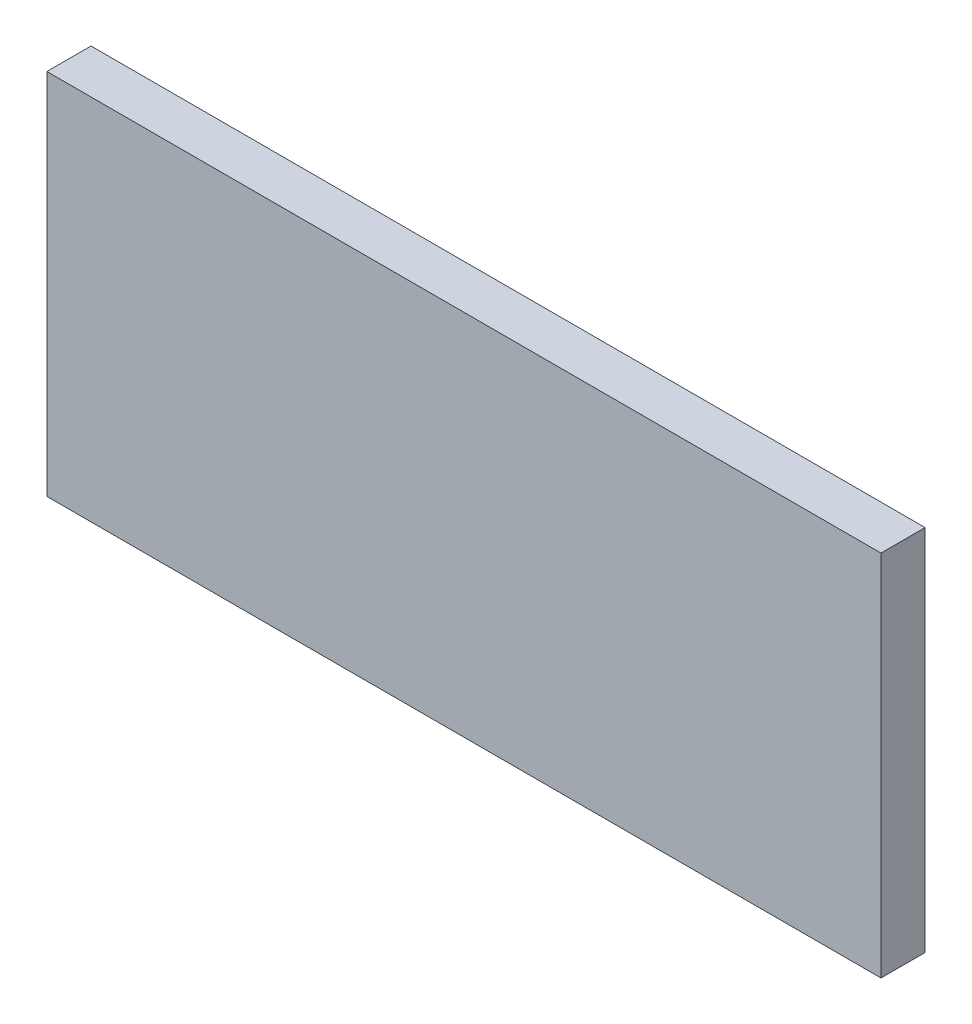
ISO-10303-21;
HEADER;
FILE_DESCRIPTION(('STEP AP214'),'2;1');
FILE_NAME('part.step','',(''),(''),'','','');
FILE_SCHEMA(('AUTOMOTIVE_DESIGN { 1 0 10303 214 1 1 1 1 }'));
ENDSEC;
DATA;
#1=APPLICATION_CONTEXT('core data for automotive mechanical design processes');
#2=APPLICATION_PROTOCOL_DEFINITION('international standard','automotive_design',2000,#1);
#3=PRODUCT_CONTEXT('',#1,'mechanical');
#4=PRODUCT('Part','Part','',(#3));
#5=PRODUCT_RELATED_PRODUCT_CATEGORY('part','',(#4));
#6=PRODUCT_DEFINITION_FORMATION('','',#4);
#7=PRODUCT_DEFINITION_CONTEXT('part definition',#1,'design');
#8=PRODUCT_DEFINITION('design','',#6,#7);
#9=PRODUCT_DEFINITION_SHAPE('','',#8);
#10=(LENGTH_UNIT() NAMED_UNIT(*) SI_UNIT(.MILLI.,.METRE.));
#11=(NAMED_UNIT(*) PLANE_ANGLE_UNIT() SI_UNIT($,.RADIAN.));
#12=(NAMED_UNIT(*) SI_UNIT($,.STERADIAN.) SOLID_ANGLE_UNIT());
#13=UNCERTAINTY_MEASURE_WITH_UNIT(LENGTH_MEASURE(1.E-05),#10,'distance_accuracy_value','');
#14=(GEOMETRIC_REPRESENTATION_CONTEXT(3) GLOBAL_UNCERTAINTY_ASSIGNED_CONTEXT((#13)) GLOBAL_UNIT_ASSIGNED_CONTEXT((#10,
#11,#12)) REPRESENTATION_CONTEXT('',''));
#15=CARTESIAN_POINT('',(0.,0.,0.));
#16=DIRECTION('',(0.,0.,1.));
#17=DIRECTION('',(1.,0.,0.));
#18=AXIS2_PLACEMENT_3D('',#15,#16,#17);
#19=CARTESIAN_POINT('',(0.,0.,18.));
#20=DIRECTION('',(1.,0.,0.));
#21=DIRECTION('',(0.,0.,-1.));
#22=AXIS2_PLACEMENT_3D('',#19,#20,#21);
#23=PLANE('',#22);
#24=DIRECTION('',(0.,-1.,0.));
#25=VECTOR('',#24,1.);
#26=CARTESIAN_POINT('',(0.,0.,0.));
#27=LINE('',#26,#25);
#28=CARTESIAN_POINT('',(0.,150.,0.));
#29=VERTEX_POINT('',#28);
#30=CARTESIAN_POINT('',(0.,0.,0.));
#31=VERTEX_POINT('',#30);
#32=EDGE_CURVE('E96',#29,#31,#27,.T.);
#33=ORIENTED_EDGE('',*,*,#32,.T.);
#34=DIRECTION('',(0.,0.,-1.));
#35=VECTOR('',#34,1.);
#36=CARTESIAN_POINT('',(0.,0.,18.));
#37=LINE('',#36,#35);
#38=CARTESIAN_POINT('',(0.,0.,18.));
#39=VERTEX_POINT('',#38);
#40=EDGE_CURVE('E11',#39,#31,#37,.T.);
#41=ORIENTED_EDGE('',*,*,#40,.F.);
#42=DIRECTION('',(0.,-1.,0.));
#43=VECTOR('',#42,1.);
#44=CARTESIAN_POINT('',(0.,0.,18.));
#45=LINE('',#44,#43);
#46=CARTESIAN_POINT('',(0.,150.,18.));
#47=VERTEX_POINT('',#46);
#48=EDGE_CURVE('E84',#47,#39,#45,.T.);
#49=ORIENTED_EDGE('',*,*,#48,.F.);
#50=DIRECTION('',(0.,0.,-1.));
#51=VECTOR('',#50,1.);
#52=CARTESIAN_POINT('',(0.,150.,18.));
#53=LINE('',#52,#51);
#54=EDGE_CURVE('E92',#47,#29,#53,.T.);
#55=ORIENTED_EDGE('',*,*,#54,.T.);
#56=EDGE_LOOP('',(#33,#41,#49,#55));
#57=FACE_BOUND('',#56,.T.);
#58=ADVANCED_FACE('F33',(#57),#23,.F.);
#59=CARTESIAN_POINT('',(0.,0.,18.));
#60=DIRECTION('',(0.,1.,0.));
#61=DIRECTION('',(0.,0.,1.));
#62=AXIS2_PLACEMENT_3D('',#59,#60,#61);
#63=PLANE('',#62);
#64=DIRECTION('',(1.,0.,0.));
#65=VECTOR('',#64,1.);
#66=CARTESIAN_POINT('',(0.,0.,0.));
#67=LINE('',#66,#65);
#68=CARTESIAN_POINT('',(340.,0.,0.));
#69=VERTEX_POINT('',#68);
#70=EDGE_CURVE('E88',#31,#69,#67,.T.);
#71=ORIENTED_EDGE('',*,*,#70,.T.);
#72=DIRECTION('',(0.,0.,-1.));
#73=VECTOR('',#72,1.);
#74=CARTESIAN_POINT('',(340.,0.,18.));
#75=LINE('',#74,#73);
#76=CARTESIAN_POINT('',(340.,0.,18.));
#77=VERTEX_POINT('',#76);
#78=EDGE_CURVE('E41',#77,#69,#75,.T.);
#79=ORIENTED_EDGE('',*,*,#78,.F.);
#80=DIRECTION('',(1.,0.,0.));
#81=VECTOR('',#80,1.);
#82=CARTESIAN_POINT('',(0.,0.,18.));
#83=LINE('',#82,#81);
#84=EDGE_CURVE('E79',#39,#77,#83,.T.);
#85=ORIENTED_EDGE('',*,*,#84,.F.);
#86=ORIENTED_EDGE('',*,*,#40,.T.);
#87=EDGE_LOOP('',(#71,#79,#85,#86));
#88=FACE_BOUND('',#87,.T.);
#89=ADVANCED_FACE('F87',(#88),#63,.F.);
#90=CARTESIAN_POINT('',(340.,0.,18.));
#91=DIRECTION('',(-1.,0.,0.));
#92=DIRECTION('',(0.,0.,1.));
#93=AXIS2_PLACEMENT_3D('',#90,#91,#92);
#94=PLANE('',#93);
#95=DIRECTION('',(0.,1.,0.));
#96=VECTOR('',#95,1.);
#97=CARTESIAN_POINT('',(340.,0.,0.));
#98=LINE('',#97,#96);
#99=CARTESIAN_POINT('',(340.,150.,0.));
#100=VERTEX_POINT('',#99);
#101=EDGE_CURVE('E66',#69,#100,#98,.T.);
#102=ORIENTED_EDGE('',*,*,#101,.T.);
#103=DIRECTION('',(0.,0.,-1.));
#104=VECTOR('',#103,1.);
#105=CARTESIAN_POINT('',(340.,150.,18.));
#106=LINE('',#105,#104);
#107=CARTESIAN_POINT('',(340.,150.,18.));
#108=VERTEX_POINT('',#107);
#109=EDGE_CURVE('E89',#108,#100,#106,.T.);
#110=ORIENTED_EDGE('',*,*,#109,.F.);
#111=DIRECTION('',(0.,1.,0.));
#112=VECTOR('',#111,1.);
#113=CARTESIAN_POINT('',(340.,0.,18.));
#114=LINE('',#113,#112);
#115=EDGE_CURVE('E82',#77,#108,#114,.T.);
#116=ORIENTED_EDGE('',*,*,#115,.F.);
#117=ORIENTED_EDGE('',*,*,#78,.T.);
#118=EDGE_LOOP('',(#102,#110,#116,#117));
#119=FACE_BOUND('',#118,.T.);
#120=ADVANCED_FACE('F90',(#119),#94,.F.);
#121=CARTESIAN_POINT('',(0.,150.,18.));
#122=DIRECTION('',(0.,-1.,0.));
#123=DIRECTION('',(0.,0.,-1.));
#124=AXIS2_PLACEMENT_3D('',#121,#122,#123);
#125=PLANE('',#124);
#126=DIRECTION('',(-1.,0.,0.));
#127=VECTOR('',#126,1.);
#128=CARTESIAN_POINT('',(0.,150.,0.));
#129=LINE('',#128,#127);
#130=EDGE_CURVE('E72',#100,#29,#129,.T.);
#131=ORIENTED_EDGE('',*,*,#130,.T.);
#132=ORIENTED_EDGE('',*,*,#54,.F.);
#133=DIRECTION('',(-1.,0.,0.));
#134=VECTOR('',#133,1.);
#135=CARTESIAN_POINT('',(0.,150.,18.));
#136=LINE('',#135,#134);
#137=EDGE_CURVE('E49',#108,#47,#136,.T.);
#138=ORIENTED_EDGE('',*,*,#137,.F.);
#139=ORIENTED_EDGE('',*,*,#109,.T.);
#140=EDGE_LOOP('',(#131,#132,#138,#139));
#141=FACE_BOUND('',#140,.T.);
#142=ADVANCED_FACE('F103',(#141),#125,.F.);
#143=CARTESIAN_POINT('',(0.,0.,18.));
#144=DIRECTION('',(0.,0.,-1.));
#145=DIRECTION('',(-1.,0.,0.));
#146=AXIS2_PLACEMENT_3D('',#143,#144,#145);
#147=PLANE('',#146);
#148=ORIENTED_EDGE('',*,*,#48,.T.);
#149=ORIENTED_EDGE('',*,*,#84,.T.);
#150=ORIENTED_EDGE('',*,*,#115,.T.);
#151=ORIENTED_EDGE('',*,*,#137,.T.);
#152=EDGE_LOOP('',(#148,#149,#150,#151));
#153=FACE_BOUND('',#152,.T.);
#154=ADVANCED_FACE('F80',(#153),#147,.F.);
#155=CARTESIAN_POINT('',(0.,0.,0.));
#156=DIRECTION('',(0.,0.,-1.));
#157=DIRECTION('',(-1.,0.,0.));
#158=AXIS2_PLACEMENT_3D('',#155,#156,#157);
#159=PLANE('',#158);
#160=ORIENTED_EDGE('',*,*,#32,.F.);
#161=ORIENTED_EDGE('',*,*,#130,.F.);
#162=ORIENTED_EDGE('',*,*,#101,.F.);
#163=ORIENTED_EDGE('',*,*,#70,.F.);
#164=EDGE_LOOP('',(#160,#161,#162,#163));
#165=FACE_BOUND('',#164,.T.);
#166=ADVANCED_FACE('F106',(#165),#159,.T.);
#167=CLOSED_SHELL('',(#58,#89,#120,#142,#154,#166));
#168=MANIFOLD_SOLID_BREP('B2',#167);
#169=ADVANCED_BREP_SHAPE_REPRESENTATION('',(#18,#168),#14);
#170=SHAPE_DEFINITION_REPRESENTATION(#9,#169);
ENDSEC;
END-ISO-10303-21;
